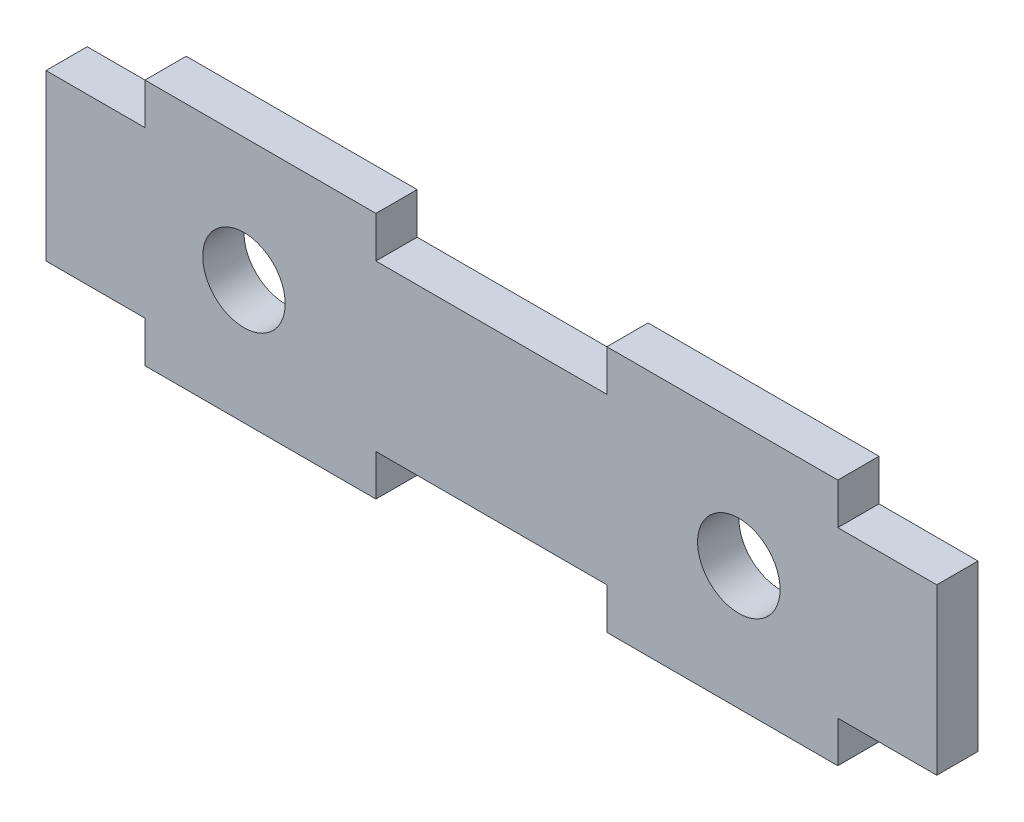
ISO-10303-21;
HEADER;
FILE_DESCRIPTION(('STEP AP214'),'2;1');
FILE_NAME('part.step','',(''),(''),'','','');
FILE_SCHEMA(('AUTOMOTIVE_DESIGN { 1 0 10303 214 1 1 1 1 }'));
ENDSEC;
DATA;
#1=APPLICATION_CONTEXT('core data for automotive mechanical design processes');
#2=APPLICATION_PROTOCOL_DEFINITION('international standard','automotive_design',2000,#1);
#3=PRODUCT_CONTEXT('',#1,'mechanical');
#4=PRODUCT('Part','Part','',(#3));
#5=PRODUCT_RELATED_PRODUCT_CATEGORY('part','',(#4));
#6=PRODUCT_DEFINITION_FORMATION('','',#4);
#7=PRODUCT_DEFINITION_CONTEXT('part definition',#1,'design');
#8=PRODUCT_DEFINITION('design','',#6,#7);
#9=PRODUCT_DEFINITION_SHAPE('','',#8);
#10=(LENGTH_UNIT() NAMED_UNIT(*) SI_UNIT(.MILLI.,.METRE.));
#11=(NAMED_UNIT(*) PLANE_ANGLE_UNIT() SI_UNIT($,.RADIAN.));
#12=(NAMED_UNIT(*) SI_UNIT($,.STERADIAN.) SOLID_ANGLE_UNIT());
#13=UNCERTAINTY_MEASURE_WITH_UNIT(LENGTH_MEASURE(1.E-05),#10,'distance_accuracy_value','');
#14=(GEOMETRIC_REPRESENTATION_CONTEXT(3) GLOBAL_UNCERTAINTY_ASSIGNED_CONTEXT((#13)) GLOBAL_UNIT_ASSIGNED_CONTEXT((#10,
#11,#12)) REPRESENTATION_CONTEXT('',''));
#15=CARTESIAN_POINT('',(0.,0.,0.));
#16=DIRECTION('',(0.,0.,1.));
#17=DIRECTION('',(1.,0.,0.));
#18=AXIS2_PLACEMENT_3D('',#15,#16,#17);
#19=CARTESIAN_POINT('',(0.,0.,3.175));
#20=DIRECTION('',(0.,0.,1.));
#21=DIRECTION('',(1.,0.,0.));
#22=AXIS2_PLACEMENT_3D('',#19,#20,#21);
#23=PLANE('',#22);
#24=DIRECTION('',(0.,-1.,0.));
#25=VECTOR('',#24,1.);
#26=CARTESIAN_POINT('',(72.39,-3.175,3.175));
#27=LINE('',#26,#25);
#28=CARTESIAN_POINT('',(72.39,-3.175,3.175));
#29=VERTEX_POINT('',#28);
#30=CARTESIAN_POINT('',(72.39,-15.875,3.175));
#31=VERTEX_POINT('',#30);
#32=EDGE_CURVE('E49',#29,#31,#27,.T.);
#33=ORIENTED_EDGE('',*,*,#32,.F.);
#34=DIRECTION('',(-1.,0.,0.));
#35=VECTOR('',#34,1.);
#36=CARTESIAN_POINT('',(76.2,-3.175,3.175));
#37=LINE('',#36,#35);
#38=CARTESIAN_POINT('',(64.77,-3.175,3.175));
#39=VERTEX_POINT('',#38);
#40=EDGE_CURVE('E184',#29,#39,#37,.T.);
#41=ORIENTED_EDGE('',*,*,#40,.T.);
#42=DIRECTION('',(0.,1.,0.));
#43=VECTOR('',#42,1.);
#44=CARTESIAN_POINT('',(64.77,0.,3.175));
#45=LINE('',#44,#43);
#46=CARTESIAN_POINT('',(64.77,0.,3.175));
#47=VERTEX_POINT('',#46);
#48=EDGE_CURVE('E197',#39,#47,#45,.T.);
#49=ORIENTED_EDGE('',*,*,#48,.T.);
#50=DIRECTION('',(-1.,0.,0.));
#51=VECTOR('',#50,1.);
#52=CARTESIAN_POINT('',(0.,0.,3.175));
#53=LINE('',#52,#51);
#54=CARTESIAN_POINT('',(46.99,0.,3.175));
#55=VERTEX_POINT('',#54);
#56=EDGE_CURVE('E11',#47,#55,#53,.T.);
#57=ORIENTED_EDGE('',*,*,#56,.T.);
#58=DIRECTION('',(0.,1.,0.));
#59=VECTOR('',#58,1.);
#60=CARTESIAN_POINT('',(46.99,-3.175,3.175));
#61=LINE('',#60,#59);
#62=CARTESIAN_POINT('',(46.99,-3.175,3.175));
#63=VERTEX_POINT('',#62);
#64=EDGE_CURVE('E281',#63,#55,#61,.T.);
#65=ORIENTED_EDGE('',*,*,#64,.F.);
#66=DIRECTION('',(1.,0.,0.));
#67=VECTOR('',#66,1.);
#68=CARTESIAN_POINT('',(29.21,-3.175,3.175));
#69=LINE('',#68,#67);
#70=CARTESIAN_POINT('',(29.21,-3.175,3.175));
#71=VERTEX_POINT('',#70);
#72=EDGE_CURVE('E290',#71,#63,#69,.T.);
#73=ORIENTED_EDGE('',*,*,#72,.F.);
#74=DIRECTION('',(0.,-1.,0.));
#75=VECTOR('',#74,1.);
#76=CARTESIAN_POINT('',(29.21,-3.175,3.175));
#77=LINE('',#76,#75);
#78=CARTESIAN_POINT('',(29.21,0.,3.175));
#79=VERTEX_POINT('',#78);
#80=EDGE_CURVE('E275',#79,#71,#77,.T.);
#81=ORIENTED_EDGE('',*,*,#80,.F.);
#82=CARTESIAN_POINT('',(11.43,0.,3.175));
#83=VERTEX_POINT('',#82);
#84=EDGE_CURVE('E41',#79,#83,#53,.T.);
#85=ORIENTED_EDGE('',*,*,#84,.T.);
#86=DIRECTION('',(0.,1.,0.));
#87=VECTOR('',#86,1.);
#88=CARTESIAN_POINT('',(11.43,0.,3.175));
#89=LINE('',#88,#87);
#90=CARTESIAN_POINT('',(11.43,-3.175,3.175));
#91=VERTEX_POINT('',#90);
#92=EDGE_CURVE('E207',#91,#83,#89,.T.);
#93=ORIENTED_EDGE('',*,*,#92,.F.);
#94=DIRECTION('',(1.,0.,0.));
#95=VECTOR('',#94,1.);
#96=CARTESIAN_POINT('',(0.,-3.175,3.175));
#97=LINE('',#96,#95);
#98=CARTESIAN_POINT('',(3.81,-3.175,3.175));
#99=VERTEX_POINT('',#98);
#100=EDGE_CURVE('E202',#99,#91,#97,.T.);
#101=ORIENTED_EDGE('',*,*,#100,.F.);
#102=DIRECTION('',(0.,1.,0.));
#103=VECTOR('',#102,1.);
#104=CARTESIAN_POINT('',(3.81,-3.175,3.175));
#105=LINE('',#104,#103);
#106=CARTESIAN_POINT('',(3.81,-15.875,3.175));
#107=VERTEX_POINT('',#106);
#108=EDGE_CURVE('E363',#107,#99,#105,.T.);
#109=ORIENTED_EDGE('',*,*,#108,.F.);
#110=DIRECTION('',(1.,0.,0.));
#111=VECTOR('',#110,1.);
#112=CARTESIAN_POINT('',(0.,-15.875,3.175));
#113=LINE('',#112,#111);
#114=CARTESIAN_POINT('',(11.43,-15.875,3.175));
#115=VERTEX_POINT('',#114);
#116=EDGE_CURVE('E266',#107,#115,#113,.T.);
#117=ORIENTED_EDGE('',*,*,#116,.T.);
#118=DIRECTION('',(0.,-1.,0.));
#119=VECTOR('',#118,1.);
#120=CARTESIAN_POINT('',(11.43,-19.05,3.175));
#121=LINE('',#120,#119);
#122=CARTESIAN_POINT('',(11.43,-19.05,3.175));
#123=VERTEX_POINT('',#122);
#124=EDGE_CURVE('E249',#115,#123,#121,.T.);
#125=ORIENTED_EDGE('',*,*,#124,.T.);
#126=DIRECTION('',(1.,0.,0.));
#127=VECTOR('',#126,1.);
#128=CARTESIAN_POINT('',(0.,-19.05,3.175));
#129=LINE('',#128,#127);
#130=CARTESIAN_POINT('',(29.21,-19.05,3.175));
#131=VERTEX_POINT('',#130);
#132=EDGE_CURVE('E220',#123,#131,#129,.T.);
#133=ORIENTED_EDGE('',*,*,#132,.T.);
#134=DIRECTION('',(0.,1.,0.));
#135=VECTOR('',#134,1.);
#136=CARTESIAN_POINT('',(29.21,-15.875,3.175));
#137=LINE('',#136,#135);
#138=CARTESIAN_POINT('',(29.21,-15.875,3.175));
#139=VERTEX_POINT('',#138);
#140=EDGE_CURVE('E328',#131,#139,#137,.T.);
#141=ORIENTED_EDGE('',*,*,#140,.T.);
#142=DIRECTION('',(1.,0.,0.));
#143=VECTOR('',#142,1.);
#144=CARTESIAN_POINT('',(29.21,-15.875,3.175));
#145=LINE('',#144,#143);
#146=CARTESIAN_POINT('',(46.99,-15.875,3.175));
#147=VERTEX_POINT('',#146);
#148=EDGE_CURVE('E325',#139,#147,#145,.T.);
#149=ORIENTED_EDGE('',*,*,#148,.T.);
#150=DIRECTION('',(0.,-1.,0.));
#151=VECTOR('',#150,1.);
#152=CARTESIAN_POINT('',(46.99,-15.875,3.175));
#153=LINE('',#152,#151);
#154=CARTESIAN_POINT('',(46.99,-19.05,3.175));
#155=VERTEX_POINT('',#154);
#156=EDGE_CURVE('E323',#147,#155,#153,.T.);
#157=ORIENTED_EDGE('',*,*,#156,.T.);
#158=CARTESIAN_POINT('',(64.77,-19.05,3.175));
#159=VERTEX_POINT('',#158);
#160=EDGE_CURVE('E222',#155,#159,#129,.T.);
#161=ORIENTED_EDGE('',*,*,#160,.T.);
#162=DIRECTION('',(0.,-1.,0.));
#163=VECTOR('',#162,1.);
#164=CARTESIAN_POINT('',(64.77,-19.05,3.175));
#165=LINE('',#164,#163);
#166=CARTESIAN_POINT('',(64.77,-15.875,3.175));
#167=VERTEX_POINT('',#166);
#168=EDGE_CURVE('E248',#167,#159,#165,.T.);
#169=ORIENTED_EDGE('',*,*,#168,.F.);
#170=DIRECTION('',(-1.,0.,0.));
#171=VECTOR('',#170,1.);
#172=CARTESIAN_POINT('',(76.2,-15.875,3.175));
#173=LINE('',#172,#171);
#174=EDGE_CURVE('E259',#31,#167,#173,.T.);
#175=ORIENTED_EDGE('',*,*,#174,.F.);
#176=EDGE_LOOP('',(#33,#41,#49,#57,#65,#73,#81,#85,#93,#101,#109,#117,#125,#133,#141,#149,#157,
#161,#169,#175));
#177=FACE_BOUND('',#176,.T.);
#178=CARTESIAN_POINT('',(57.15,-9.525,3.175));
#179=DIRECTION('',(0.,0.,1.));
#180=DIRECTION('',(1.,0.,0.));
#181=AXIS2_PLACEMENT_3D('',#178,#179,#180);
#182=CIRCLE('',#181,3.17500000000001);
#183=CARTESIAN_POINT('',(60.325,-9.525,3.175));
#184=VERTEX_POINT('',#183);
#185=EDGE_CURVE('E352',#184,#184,#182,.T.);
#186=ORIENTED_EDGE('',*,*,#185,.F.);
#187=EDGE_LOOP('',(#186));
#188=FACE_BOUND('',#187,.T.);
#189=CARTESIAN_POINT('',(19.05,-9.525,3.175));
#190=DIRECTION('',(0.,0.,1.));
#191=DIRECTION('',(1.,0.,0.));
#192=AXIS2_PLACEMENT_3D('',#189,#190,#191);
#193=CIRCLE('',#192,3.17500000000001);
#194=CARTESIAN_POINT('',(22.225,-9.525,3.175));
#195=VERTEX_POINT('',#194);
#196=EDGE_CURVE('E358',#195,#195,#193,.T.);
#197=ORIENTED_EDGE('',*,*,#196,.F.);
#198=EDGE_LOOP('',(#197));
#199=FACE_BOUND('',#198,.T.);
#200=ADVANCED_FACE('F32',(#177,#188,#199),#23,.T.);
#201=CARTESIAN_POINT('',(0.,0.,0.));
#202=DIRECTION('',(0.,0.,1.));
#203=DIRECTION('',(1.,0.,0.));
#204=AXIS2_PLACEMENT_3D('',#201,#202,#203);
#205=PLANE('',#204);
#206=CARTESIAN_POINT('',(57.15,-9.525,0.));
#207=DIRECTION('',(0.,0.,1.));
#208=DIRECTION('',(1.,0.,0.));
#209=AXIS2_PLACEMENT_3D('',#206,#207,#208);
#210=CIRCLE('',#209,3.17500000000001);
#211=CARTESIAN_POINT('',(60.325,-9.525,0.));
#212=VERTEX_POINT('',#211);
#213=EDGE_CURVE('E332',#212,#212,#210,.T.);
#214=ORIENTED_EDGE('',*,*,#213,.T.);
#215=EDGE_LOOP('',(#214));
#216=FACE_BOUND('',#215,.T.);
#217=CARTESIAN_POINT('',(19.05,-9.525,0.));
#218=DIRECTION('',(0.,0.,1.));
#219=DIRECTION('',(1.,0.,0.));
#220=AXIS2_PLACEMENT_3D('',#217,#218,#219);
#221=CIRCLE('',#220,3.17500000000001);
#222=CARTESIAN_POINT('',(22.225,-9.525,0.));
#223=VERTEX_POINT('',#222);
#224=EDGE_CURVE('E355',#223,#223,#221,.T.);
#225=ORIENTED_EDGE('',*,*,#224,.T.);
#226=EDGE_LOOP('',(#225));
#227=FACE_BOUND('',#226,.T.);
#228=DIRECTION('',(-1.,0.,0.));
#229=VECTOR('',#228,1.);
#230=CARTESIAN_POINT('',(76.2,-3.175,0.));
#231=LINE('',#230,#229);
#232=CARTESIAN_POINT('',(72.39,-3.175,0.));
#233=VERTEX_POINT('',#232);
#234=CARTESIAN_POINT('',(64.77,-3.175,0.));
#235=VERTEX_POINT('',#234);
#236=EDGE_CURVE('E182',#233,#235,#231,.T.);
#237=ORIENTED_EDGE('',*,*,#236,.F.);
#238=DIRECTION('',(0.,1.,0.));
#239=VECTOR('',#238,1.);
#240=CARTESIAN_POINT('',(72.39,-3.175,0.));
#241=LINE('',#240,#239);
#242=CARTESIAN_POINT('',(72.39,-15.875,0.));
#243=VERTEX_POINT('',#242);
#244=EDGE_CURVE('E169',#243,#233,#241,.T.);
#245=ORIENTED_EDGE('',*,*,#244,.F.);
#246=DIRECTION('',(-1.,0.,0.));
#247=VECTOR('',#246,1.);
#248=CARTESIAN_POINT('',(76.2,-15.875,0.));
#249=LINE('',#248,#247);
#250=CARTESIAN_POINT('',(64.77,-15.875,0.));
#251=VERTEX_POINT('',#250);
#252=EDGE_CURVE('E252',#243,#251,#249,.T.);
#253=ORIENTED_EDGE('',*,*,#252,.T.);
#254=DIRECTION('',(0.,-1.,0.));
#255=VECTOR('',#254,1.);
#256=CARTESIAN_POINT('',(64.77,-19.05,0.));
#257=LINE('',#256,#255);
#258=CARTESIAN_POINT('',(64.77,-19.05,0.));
#259=VERTEX_POINT('',#258);
#260=EDGE_CURVE('E246',#251,#259,#257,.T.);
#261=ORIENTED_EDGE('',*,*,#260,.T.);
#262=DIRECTION('',(1.,0.,0.));
#263=VECTOR('',#262,1.);
#264=CARTESIAN_POINT('',(0.,-19.05,0.));
#265=LINE('',#264,#263);
#266=CARTESIAN_POINT('',(46.99,-19.05,0.));
#267=VERTEX_POINT('',#266);
#268=EDGE_CURVE('E217',#267,#259,#265,.T.);
#269=ORIENTED_EDGE('',*,*,#268,.F.);
#270=DIRECTION('',(0.,-1.,0.));
#271=VECTOR('',#270,1.);
#272=CARTESIAN_POINT('',(46.99,-15.875,0.));
#273=LINE('',#272,#271);
#274=CARTESIAN_POINT('',(46.99,-15.875,0.));
#275=VERTEX_POINT('',#274);
#276=EDGE_CURVE('E343',#275,#267,#273,.T.);
#277=ORIENTED_EDGE('',*,*,#276,.F.);
#278=DIRECTION('',(1.,0.,0.));
#279=VECTOR('',#278,1.);
#280=CARTESIAN_POINT('',(29.21,-15.875,0.));
#281=LINE('',#280,#279);
#282=CARTESIAN_POINT('',(29.21,-15.875,0.));
#283=VERTEX_POINT('',#282);
#284=EDGE_CURVE('E341',#283,#275,#281,.T.);
#285=ORIENTED_EDGE('',*,*,#284,.F.);
#286=DIRECTION('',(0.,1.,0.));
#287=VECTOR('',#286,1.);
#288=CARTESIAN_POINT('',(29.21,-15.875,0.));
#289=LINE('',#288,#287);
#290=CARTESIAN_POINT('',(29.21,-19.05,0.));
#291=VERTEX_POINT('',#290);
#292=EDGE_CURVE('E330',#291,#283,#289,.T.);
#293=ORIENTED_EDGE('',*,*,#292,.F.);
#294=CARTESIAN_POINT('',(11.43,-19.05,0.));
#295=VERTEX_POINT('',#294);
#296=EDGE_CURVE('E223',#295,#291,#265,.T.);
#297=ORIENTED_EDGE('',*,*,#296,.F.);
#298=DIRECTION('',(0.,-1.,0.));
#299=VECTOR('',#298,1.);
#300=CARTESIAN_POINT('',(11.43,-19.05,0.));
#301=LINE('',#300,#299);
#302=CARTESIAN_POINT('',(11.43,-15.875,0.));
#303=VERTEX_POINT('',#302);
#304=EDGE_CURVE('E263',#303,#295,#301,.T.);
#305=ORIENTED_EDGE('',*,*,#304,.F.);
#306=DIRECTION('',(1.,0.,0.));
#307=VECTOR('',#306,1.);
#308=CARTESIAN_POINT('',(0.,-15.875,0.));
#309=LINE('',#308,#307);
#310=CARTESIAN_POINT('',(3.81,-15.875,0.));
#311=VERTEX_POINT('',#310);
#312=EDGE_CURVE('E265',#311,#303,#309,.T.);
#313=ORIENTED_EDGE('',*,*,#312,.F.);
#314=DIRECTION('',(0.,-1.,0.));
#315=VECTOR('',#314,1.);
#316=CARTESIAN_POINT('',(3.81,-3.175,0.));
#317=LINE('',#316,#315);
#318=CARTESIAN_POINT('',(3.81,-3.175,0.));
#319=VERTEX_POINT('',#318);
#320=EDGE_CURVE('E57',#319,#311,#317,.T.);
#321=ORIENTED_EDGE('',*,*,#320,.F.);
#322=DIRECTION('',(1.,0.,0.));
#323=VECTOR('',#322,1.);
#324=CARTESIAN_POINT('',(0.,-3.175,0.));
#325=LINE('',#324,#323);
#326=CARTESIAN_POINT('',(11.43,-3.175,0.));
#327=VERTEX_POINT('',#326);
#328=EDGE_CURVE('E204',#319,#327,#325,.T.);
#329=ORIENTED_EDGE('',*,*,#328,.T.);
#330=DIRECTION('',(0.,1.,0.));
#331=VECTOR('',#330,1.);
#332=CARTESIAN_POINT('',(11.43,0.,0.));
#333=LINE('',#332,#331);
#334=CARTESIAN_POINT('',(11.43,0.,0.));
#335=VERTEX_POINT('',#334);
#336=EDGE_CURVE('E206',#327,#335,#333,.T.);
#337=ORIENTED_EDGE('',*,*,#336,.T.);
#338=DIRECTION('',(-1.,0.,0.));
#339=VECTOR('',#338,1.);
#340=CARTESIAN_POINT('',(0.,0.,0.));
#341=LINE('',#340,#339);
#342=CARTESIAN_POINT('',(29.21,0.,0.));
#343=VERTEX_POINT('',#342);
#344=EDGE_CURVE('E225',#343,#335,#341,.T.);
#345=ORIENTED_EDGE('',*,*,#344,.F.);
#346=DIRECTION('',(0.,-1.,0.));
#347=VECTOR('',#346,1.);
#348=CARTESIAN_POINT('',(29.21,-3.175,0.));
#349=LINE('',#348,#347);
#350=CARTESIAN_POINT('',(29.21,-3.175,0.));
#351=VERTEX_POINT('',#350);
#352=EDGE_CURVE('E277',#343,#351,#349,.T.);
#353=ORIENTED_EDGE('',*,*,#352,.T.);
#354=DIRECTION('',(1.,0.,0.));
#355=VECTOR('',#354,1.);
#356=CARTESIAN_POINT('',(29.21,-3.175,0.));
#357=LINE('',#356,#355);
#358=CARTESIAN_POINT('',(46.99,-3.175,0.));
#359=VERTEX_POINT('',#358);
#360=EDGE_CURVE('E280',#351,#359,#357,.T.);
#361=ORIENTED_EDGE('',*,*,#360,.T.);
#362=DIRECTION('',(0.,1.,0.));
#363=VECTOR('',#362,1.);
#364=CARTESIAN_POINT('',(46.99,-3.175,0.));
#365=LINE('',#364,#363);
#366=CARTESIAN_POINT('',(46.99,0.,0.));
#367=VERTEX_POINT('',#366);
#368=EDGE_CURVE('E284',#359,#367,#365,.T.);
#369=ORIENTED_EDGE('',*,*,#368,.T.);
#370=CARTESIAN_POINT('',(64.77,0.,0.));
#371=VERTEX_POINT('',#370);
#372=EDGE_CURVE('E36',#371,#367,#341,.T.);
#373=ORIENTED_EDGE('',*,*,#372,.F.);
#374=DIRECTION('',(0.,1.,0.));
#375=VECTOR('',#374,1.);
#376=CARTESIAN_POINT('',(64.77,0.,0.));
#377=LINE('',#376,#375);
#378=EDGE_CURVE('E189',#235,#371,#377,.T.);
#379=ORIENTED_EDGE('',*,*,#378,.F.);
#380=EDGE_LOOP('',(#237,#245,#253,#261,#269,#277,#285,#293,#297,#305,#313,#321,#329,#337,#345,
#353,#361,#369,#373,#379));
#381=FACE_BOUND('',#380,.T.);
#382=ADVANCED_FACE('F187',(#216,#227,#381),#205,.F.);
#383=CARTESIAN_POINT('',(0.,-3.175,0.));
#384=DIRECTION('',(0.,-1.,0.));
#385=DIRECTION('',(0.,0.,-1.));
#386=AXIS2_PLACEMENT_3D('',#383,#384,#385);
#387=PLANE('',#386);
#388=DIRECTION('',(0.,0.,-1.));
#389=VECTOR('',#388,1.);
#390=CARTESIAN_POINT('',(3.81,-3.175,0.));
#391=LINE('',#390,#389);
#392=EDGE_CURVE('E361',#99,#319,#391,.T.);
#393=ORIENTED_EDGE('',*,*,#392,.F.);
#394=ORIENTED_EDGE('',*,*,#100,.T.);
#395=DIRECTION('',(0.,0.,1.));
#396=VECTOR('',#395,1.);
#397=CARTESIAN_POINT('',(11.43,-3.175,0.));
#398=LINE('',#397,#396);
#399=EDGE_CURVE('E210',#327,#91,#398,.T.);
#400=ORIENTED_EDGE('',*,*,#399,.F.);
#401=ORIENTED_EDGE('',*,*,#328,.F.);
#402=EDGE_LOOP('',(#393,#394,#400,#401));
#403=FACE_BOUND('',#402,.T.);
#404=ADVANCED_FACE('F405',(#403),#387,.F.);
#405=CARTESIAN_POINT('',(0.,-15.875,0.));
#406=DIRECTION('',(0.,-1.,0.));
#407=DIRECTION('',(0.,0.,-1.));
#408=AXIS2_PLACEMENT_3D('',#405,#406,#407);
#409=PLANE('',#408);
#410=ORIENTED_EDGE('',*,*,#116,.F.);
#411=DIRECTION('',(0.,0.,1.));
#412=VECTOR('',#411,1.);
#413=CARTESIAN_POINT('',(3.81,-15.875,0.));
#414=LINE('',#413,#412);
#415=EDGE_CURVE('E365',#311,#107,#414,.T.);
#416=ORIENTED_EDGE('',*,*,#415,.F.);
#417=ORIENTED_EDGE('',*,*,#312,.T.);
#418=DIRECTION('',(0.,0.,1.));
#419=VECTOR('',#418,1.);
#420=CARTESIAN_POINT('',(11.43,-15.875,0.));
#421=LINE('',#420,#419);
#422=EDGE_CURVE('E272',#303,#115,#421,.T.);
#423=ORIENTED_EDGE('',*,*,#422,.T.);
#424=EDGE_LOOP('',(#410,#416,#417,#423));
#425=FACE_BOUND('',#424,.T.);
#426=ADVANCED_FACE('F377',(#425),#409,.T.);
#427=CARTESIAN_POINT('',(0.,-19.05,3.175));
#428=DIRECTION('',(0.,1.,0.));
#429=DIRECTION('',(0.,0.,1.));
#430=AXIS2_PLACEMENT_3D('',#427,#428,#429);
#431=PLANE('',#430);
#432=DIRECTION('',(0.,0.,1.));
#433=VECTOR('',#432,1.);
#434=CARTESIAN_POINT('',(29.21,-19.05,0.));
#435=LINE('',#434,#433);
#436=EDGE_CURVE('E340',#291,#131,#435,.T.);
#437=ORIENTED_EDGE('',*,*,#436,.T.);
#438=ORIENTED_EDGE('',*,*,#132,.F.);
#439=DIRECTION('',(0.,0.,1.));
#440=VECTOR('',#439,1.);
#441=CARTESIAN_POINT('',(11.43,-19.05,0.));
#442=LINE('',#441,#440);
#443=EDGE_CURVE('E268',#295,#123,#442,.T.);
#444=ORIENTED_EDGE('',*,*,#443,.F.);
#445=ORIENTED_EDGE('',*,*,#296,.T.);
#446=EDGE_LOOP('',(#437,#438,#444,#445));
#447=FACE_BOUND('',#446,.T.);
#448=ADVANCED_FACE('F34',(#447),#431,.F.);
#449=DIRECTION('',(0.,0.,1.));
#450=VECTOR('',#449,1.);
#451=CARTESIAN_POINT('',(46.99,-19.05,0.));
#452=LINE('',#451,#450);
#453=EDGE_CURVE('E238',#267,#155,#452,.T.);
#454=ORIENTED_EDGE('',*,*,#453,.F.);
#455=ORIENTED_EDGE('',*,*,#268,.T.);
#456=DIRECTION('',(0.,0.,1.));
#457=VECTOR('',#456,1.);
#458=CARTESIAN_POINT('',(64.77,-19.05,0.));
#459=LINE('',#458,#457);
#460=EDGE_CURVE('E237',#259,#159,#459,.T.);
#461=ORIENTED_EDGE('',*,*,#460,.T.);
#462=ORIENTED_EDGE('',*,*,#160,.F.);
#463=EDGE_LOOP('',(#454,#455,#461,#462));
#464=FACE_BOUND('',#463,.T.);
#465=ADVANCED_FACE('F235',(#464),#431,.F.);
#466=CARTESIAN_POINT('',(0.,0.,3.175));
#467=DIRECTION('',(0.,-1.,0.));
#468=DIRECTION('',(0.,0.,-1.));
#469=AXIS2_PLACEMENT_3D('',#466,#467,#468);
#470=PLANE('',#469);
#471=ORIENTED_EDGE('',*,*,#84,.F.);
#472=DIRECTION('',(0.,0.,1.));
#473=VECTOR('',#472,1.);
#474=CARTESIAN_POINT('',(29.21,0.,0.));
#475=LINE('',#474,#473);
#476=EDGE_CURVE('E200',#343,#79,#475,.T.);
#477=ORIENTED_EDGE('',*,*,#476,.F.);
#478=ORIENTED_EDGE('',*,*,#344,.T.);
#479=DIRECTION('',(0.,0.,1.));
#480=VECTOR('',#479,1.);
#481=CARTESIAN_POINT('',(11.43,0.,0.));
#482=LINE('',#481,#480);
#483=EDGE_CURVE('E214',#335,#83,#482,.T.);
#484=ORIENTED_EDGE('',*,*,#483,.T.);
#485=EDGE_LOOP('',(#471,#477,#478,#484));
#486=FACE_BOUND('',#485,.T.);
#487=ADVANCED_FACE('F412',(#486),#470,.F.);
#488=ORIENTED_EDGE('',*,*,#372,.T.);
#489=DIRECTION('',(0.,0.,1.));
#490=VECTOR('',#489,1.);
#491=CARTESIAN_POINT('',(46.99,0.,0.));
#492=LINE('',#491,#490);
#493=EDGE_CURVE('E295',#367,#55,#492,.T.);
#494=ORIENTED_EDGE('',*,*,#493,.T.);
#495=ORIENTED_EDGE('',*,*,#56,.F.);
#496=DIRECTION('',(0.,0.,1.));
#497=VECTOR('',#496,1.);
#498=CARTESIAN_POINT('',(64.77,0.,0.));
#499=LINE('',#498,#497);
#500=EDGE_CURVE('E190',#371,#47,#499,.T.);
#501=ORIENTED_EDGE('',*,*,#500,.F.);
#502=EDGE_LOOP('',(#488,#494,#495,#501));
#503=FACE_BOUND('',#502,.T.);
#504=ADVANCED_FACE('F317',(#503),#470,.F.);
#505=CARTESIAN_POINT('',(11.43,0.,0.));
#506=DIRECTION('',(1.,0.,0.));
#507=DIRECTION('',(0.,0.,-1.));
#508=AXIS2_PLACEMENT_3D('',#505,#506,#507);
#509=PLANE('',#508);
#510=ORIENTED_EDGE('',*,*,#92,.T.);
#511=ORIENTED_EDGE('',*,*,#483,.F.);
#512=ORIENTED_EDGE('',*,*,#336,.F.);
#513=ORIENTED_EDGE('',*,*,#399,.T.);
#514=EDGE_LOOP('',(#510,#511,#512,#513));
#515=FACE_BOUND('',#514,.T.);
#516=ADVANCED_FACE('F411',(#515),#509,.F.);
#517=CARTESIAN_POINT('',(76.2,-3.175,0.));
#518=DIRECTION('',(0.,1.,0.));
#519=DIRECTION('',(0.,0.,1.));
#520=AXIS2_PLACEMENT_3D('',#517,#518,#519);
#521=PLANE('',#520);
#522=DIRECTION('',(0.,0.,1.));
#523=VECTOR('',#522,1.);
#524=CARTESIAN_POINT('',(72.39,-3.175,0.));
#525=LINE('',#524,#523);
#526=EDGE_CURVE('E172',#233,#29,#525,.T.);
#527=ORIENTED_EDGE('',*,*,#526,.F.);
#528=ORIENTED_EDGE('',*,*,#236,.T.);
#529=DIRECTION('',(0.,0.,1.));
#530=VECTOR('',#529,1.);
#531=CARTESIAN_POINT('',(64.77,-3.175,0.));
#532=LINE('',#531,#530);
#533=EDGE_CURVE('E192',#235,#39,#532,.T.);
#534=ORIENTED_EDGE('',*,*,#533,.T.);
#535=ORIENTED_EDGE('',*,*,#40,.F.);
#536=EDGE_LOOP('',(#527,#528,#534,#535));
#537=FACE_BOUND('',#536,.T.);
#538=ADVANCED_FACE('F180',(#537),#521,.T.);
#539=CARTESIAN_POINT('',(64.77,0.,0.));
#540=DIRECTION('',(1.,0.,0.));
#541=DIRECTION('',(0.,0.,-1.));
#542=AXIS2_PLACEMENT_3D('',#539,#540,#541);
#543=PLANE('',#542);
#544=ORIENTED_EDGE('',*,*,#48,.F.);
#545=ORIENTED_EDGE('',*,*,#533,.F.);
#546=ORIENTED_EDGE('',*,*,#378,.T.);
#547=ORIENTED_EDGE('',*,*,#500,.T.);
#548=EDGE_LOOP('',(#544,#545,#546,#547));
#549=FACE_BOUND('',#548,.T.);
#550=ADVANCED_FACE('F448',(#549),#543,.T.);
#551=CARTESIAN_POINT('',(29.21,-3.175,0.));
#552=DIRECTION('',(-1.,0.,0.));
#553=DIRECTION('',(0.,0.,1.));
#554=AXIS2_PLACEMENT_3D('',#551,#552,#553);
#555=PLANE('',#554);
#556=ORIENTED_EDGE('',*,*,#80,.T.);
#557=DIRECTION('',(0.,0.,1.));
#558=VECTOR('',#557,1.);
#559=CARTESIAN_POINT('',(29.21,-3.175,0.));
#560=LINE('',#559,#558);
#561=EDGE_CURVE('E287',#351,#71,#560,.T.);
#562=ORIENTED_EDGE('',*,*,#561,.F.);
#563=ORIENTED_EDGE('',*,*,#352,.F.);
#564=ORIENTED_EDGE('',*,*,#476,.T.);
#565=EDGE_LOOP('',(#556,#562,#563,#564));
#566=FACE_BOUND('',#565,.T.);
#567=ADVANCED_FACE('F307',(#566),#555,.F.);
#568=CARTESIAN_POINT('',(46.99,-3.175,0.));
#569=DIRECTION('',(1.,0.,0.));
#570=DIRECTION('',(0.,0.,-1.));
#571=AXIS2_PLACEMENT_3D('',#568,#569,#570);
#572=PLANE('',#571);
#573=ORIENTED_EDGE('',*,*,#64,.T.);
#574=ORIENTED_EDGE('',*,*,#493,.F.);
#575=ORIENTED_EDGE('',*,*,#368,.F.);
#576=DIRECTION('',(0.,0.,1.));
#577=VECTOR('',#576,1.);
#578=CARTESIAN_POINT('',(46.99,-3.175,0.));
#579=LINE('',#578,#577);
#580=EDGE_CURVE('E298',#359,#63,#579,.T.);
#581=ORIENTED_EDGE('',*,*,#580,.T.);
#582=EDGE_LOOP('',(#573,#574,#575,#581));
#583=FACE_BOUND('',#582,.T.);
#584=ADVANCED_FACE('F314',(#583),#572,.F.);
#585=CARTESIAN_POINT('',(29.21,-3.175,0.));
#586=DIRECTION('',(0.,-1.,0.));
#587=DIRECTION('',(0.,0.,-1.));
#588=AXIS2_PLACEMENT_3D('',#585,#586,#587);
#589=PLANE('',#588);
#590=ORIENTED_EDGE('',*,*,#72,.T.);
#591=ORIENTED_EDGE('',*,*,#580,.F.);
#592=ORIENTED_EDGE('',*,*,#360,.F.);
#593=ORIENTED_EDGE('',*,*,#561,.T.);
#594=EDGE_LOOP('',(#590,#591,#592,#593));
#595=FACE_BOUND('',#594,.T.);
#596=ADVANCED_FACE('F301',(#595),#589,.F.);
#597=CARTESIAN_POINT('',(11.43,-19.05,0.));
#598=DIRECTION('',(-1.,0.,0.));
#599=DIRECTION('',(0.,0.,1.));
#600=AXIS2_PLACEMENT_3D('',#597,#598,#599);
#601=PLANE('',#600);
#602=ORIENTED_EDGE('',*,*,#124,.F.);
#603=ORIENTED_EDGE('',*,*,#422,.F.);
#604=ORIENTED_EDGE('',*,*,#304,.T.);
#605=ORIENTED_EDGE('',*,*,#443,.T.);
#606=EDGE_LOOP('',(#602,#603,#604,#605));
#607=FACE_BOUND('',#606,.T.);
#608=ADVANCED_FACE('F382',(#607),#601,.T.);
#609=CARTESIAN_POINT('',(64.77,-19.05,0.));
#610=DIRECTION('',(-1.,0.,0.));
#611=DIRECTION('',(0.,0.,1.));
#612=AXIS2_PLACEMENT_3D('',#609,#610,#611);
#613=PLANE('',#612);
#614=ORIENTED_EDGE('',*,*,#168,.T.);
#615=ORIENTED_EDGE('',*,*,#460,.F.);
#616=ORIENTED_EDGE('',*,*,#260,.F.);
#617=DIRECTION('',(0.,0.,1.));
#618=VECTOR('',#617,1.);
#619=CARTESIAN_POINT('',(64.77,-15.875,0.));
#620=LINE('',#619,#618);
#621=EDGE_CURVE('E250',#251,#167,#620,.T.);
#622=ORIENTED_EDGE('',*,*,#621,.T.);
#623=EDGE_LOOP('',(#614,#615,#616,#622));
#624=FACE_BOUND('',#623,.T.);
#625=ADVANCED_FACE('F244',(#624),#613,.F.);
#626=CARTESIAN_POINT('',(76.2,-15.875,0.));
#627=DIRECTION('',(0.,1.,0.));
#628=DIRECTION('',(0.,0.,1.));
#629=AXIS2_PLACEMENT_3D('',#626,#627,#628);
#630=PLANE('',#629);
#631=ORIENTED_EDGE('',*,*,#252,.F.);
#632=DIRECTION('',(0.,0.,-1.));
#633=VECTOR('',#632,1.);
#634=CARTESIAN_POINT('',(72.39,-15.875,0.));
#635=LINE('',#634,#633);
#636=EDGE_CURVE('E173',#31,#243,#635,.T.);
#637=ORIENTED_EDGE('',*,*,#636,.F.);
#638=ORIENTED_EDGE('',*,*,#174,.T.);
#639=ORIENTED_EDGE('',*,*,#621,.F.);
#640=EDGE_LOOP('',(#631,#637,#638,#639));
#641=FACE_BOUND('',#640,.T.);
#642=ADVANCED_FACE('F438',(#641),#630,.F.);
#643=CARTESIAN_POINT('',(29.21,-15.875,0.));
#644=DIRECTION('',(1.,0.,0.));
#645=DIRECTION('',(0.,0.,-1.));
#646=AXIS2_PLACEMENT_3D('',#643,#644,#645);
#647=PLANE('',#646);
#648=ORIENTED_EDGE('',*,*,#140,.F.);
#649=ORIENTED_EDGE('',*,*,#436,.F.);
#650=ORIENTED_EDGE('',*,*,#292,.T.);
#651=DIRECTION('',(0.,0.,1.));
#652=VECTOR('',#651,1.);
#653=CARTESIAN_POINT('',(29.21,-15.875,0.));
#654=LINE('',#653,#652);
#655=EDGE_CURVE('E261',#283,#139,#654,.T.);
#656=ORIENTED_EDGE('',*,*,#655,.T.);
#657=EDGE_LOOP('',(#648,#649,#650,#656));
#658=FACE_BOUND('',#657,.T.);
#659=ADVANCED_FACE('F385',(#658),#647,.T.);
#660=CARTESIAN_POINT('',(29.21,-15.875,0.));
#661=DIRECTION('',(0.,-1.,0.));
#662=DIRECTION('',(0.,0.,-1.));
#663=AXIS2_PLACEMENT_3D('',#660,#661,#662);
#664=PLANE('',#663);
#665=ORIENTED_EDGE('',*,*,#148,.F.);
#666=ORIENTED_EDGE('',*,*,#655,.F.);
#667=ORIENTED_EDGE('',*,*,#284,.T.);
#668=DIRECTION('',(0.,0.,1.));
#669=VECTOR('',#668,1.);
#670=CARTESIAN_POINT('',(46.99,-15.875,0.));
#671=LINE('',#670,#669);
#672=EDGE_CURVE('E338',#275,#147,#671,.T.);
#673=ORIENTED_EDGE('',*,*,#672,.T.);
#674=EDGE_LOOP('',(#665,#666,#667,#673));
#675=FACE_BOUND('',#674,.T.);
#676=ADVANCED_FACE('F386',(#675),#664,.T.);
#677=CARTESIAN_POINT('',(46.99,-15.875,0.));
#678=DIRECTION('',(-1.,0.,0.));
#679=DIRECTION('',(0.,0.,1.));
#680=AXIS2_PLACEMENT_3D('',#677,#678,#679);
#681=PLANE('',#680);
#682=ORIENTED_EDGE('',*,*,#156,.F.);
#683=ORIENTED_EDGE('',*,*,#672,.F.);
#684=ORIENTED_EDGE('',*,*,#276,.T.);
#685=ORIENTED_EDGE('',*,*,#453,.T.);
#686=EDGE_LOOP('',(#682,#683,#684,#685));
#687=FACE_BOUND('',#686,.T.);
#688=ADVANCED_FACE('F387',(#687),#681,.T.);
#689=CARTESIAN_POINT('',(57.15,-9.525,3.175));
#690=DIRECTION('',(0.,0.,1.));
#691=DIRECTION('',(1.,0.,0.));
#692=AXIS2_PLACEMENT_3D('',#689,#690,#691);
#693=CYLINDRICAL_SURFACE('',#692,3.17500000000001);
#694=ORIENTED_EDGE('',*,*,#213,.F.);
#695=EDGE_LOOP('',(#694));
#696=FACE_BOUND('',#695,.T.);
#697=ORIENTED_EDGE('',*,*,#185,.T.);
#698=EDGE_LOOP('',(#697));
#699=FACE_BOUND('',#698,.T.);
#700=ADVANCED_FACE('F389',(#696,#699),#693,.F.);
#701=CARTESIAN_POINT('',(19.05,-9.525,3.175));
#702=DIRECTION('',(0.,0.,1.));
#703=DIRECTION('',(1.,0.,0.));
#704=AXIS2_PLACEMENT_3D('',#701,#702,#703);
#705=CYLINDRICAL_SURFACE('',#704,3.17500000000001);
#706=ORIENTED_EDGE('',*,*,#224,.F.);
#707=EDGE_LOOP('',(#706));
#708=FACE_BOUND('',#707,.T.);
#709=ORIENTED_EDGE('',*,*,#196,.T.);
#710=EDGE_LOOP('',(#709));
#711=FACE_BOUND('',#710,.T.);
#712=ADVANCED_FACE('F395',(#708,#711),#705,.F.);
#713=CARTESIAN_POINT('',(3.81,0.,0.));
#714=DIRECTION('',(-1.,0.,0.));
#715=DIRECTION('',(0.,-1.,0.));
#716=AXIS2_PLACEMENT_3D('',#713,#714,#715);
#717=PLANE('',#716);
#718=ORIENTED_EDGE('',*,*,#320,.T.);
#719=ORIENTED_EDGE('',*,*,#415,.T.);
#720=ORIENTED_EDGE('',*,*,#108,.T.);
#721=ORIENTED_EDGE('',*,*,#392,.T.);
#722=EDGE_LOOP('',(#718,#719,#720,#721));
#723=FACE_BOUND('',#722,.T.);
#724=ADVANCED_FACE('F370',(#723),#717,.T.);
#725=CARTESIAN_POINT('',(72.39,0.,0.));
#726=DIRECTION('',(-1.,0.,0.));
#727=DIRECTION('',(0.,0.,1.));
#728=AXIS2_PLACEMENT_3D('',#725,#726,#727);
#729=PLANE('',#728);
#730=ORIENTED_EDGE('',*,*,#244,.T.);
#731=ORIENTED_EDGE('',*,*,#526,.T.);
#732=ORIENTED_EDGE('',*,*,#32,.T.);
#733=ORIENTED_EDGE('',*,*,#636,.T.);
#734=EDGE_LOOP('',(#730,#731,#732,#733));
#735=FACE_BOUND('',#734,.T.);
#736=ADVANCED_FACE('F171',(#735),#729,.F.);
#737=CLOSED_SHELL('',(#200,#382,#404,#426,#448,#465,#487,#504,#516,#538,#550,#567,#584,#596,
#608,#625,#642,#659,#676,#688,#700,#712,#724,#736));
#738=MANIFOLD_SOLID_BREP('B2',#737);
#739=ADVANCED_BREP_SHAPE_REPRESENTATION('',(#18,#738),#14);
#740=SHAPE_DEFINITION_REPRESENTATION(#9,#739);
ENDSEC;
END-ISO-10303-21;
